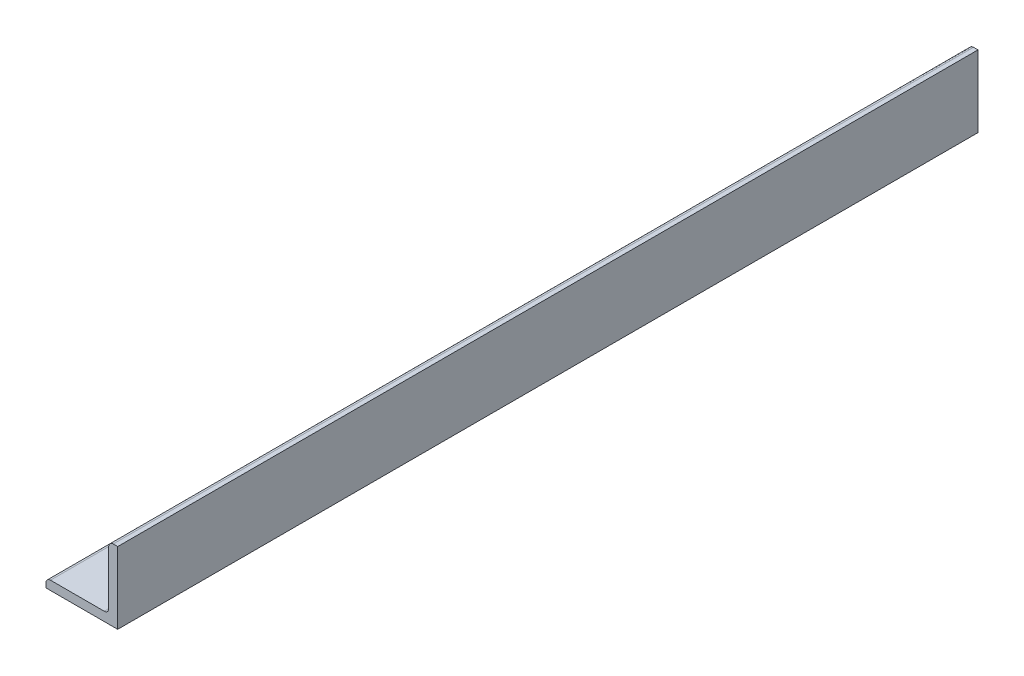
ISO-10303-21;
HEADER;
FILE_DESCRIPTION(('STEP AP214'),'2;1');
FILE_NAME('part.step','',(''),(''),'','','');
FILE_SCHEMA(('AUTOMOTIVE_DESIGN { 1 0 10303 214 1 1 1 1 }'));
ENDSEC;
DATA;
#1=APPLICATION_CONTEXT('core data for automotive mechanical design processes');
#2=APPLICATION_PROTOCOL_DEFINITION('international standard','automotive_design',2000,#1);
#3=PRODUCT_CONTEXT('',#1,'mechanical');
#4=PRODUCT('Part','Part','',(#3));
#5=PRODUCT_RELATED_PRODUCT_CATEGORY('part','',(#4));
#6=PRODUCT_DEFINITION_FORMATION('','',#4);
#7=PRODUCT_DEFINITION_CONTEXT('part definition',#1,'design');
#8=PRODUCT_DEFINITION('design','',#6,#7);
#9=PRODUCT_DEFINITION_SHAPE('','',#8);
#10=(LENGTH_UNIT() NAMED_UNIT(*) SI_UNIT(.MILLI.,.METRE.));
#11=(NAMED_UNIT(*) PLANE_ANGLE_UNIT() SI_UNIT($,.RADIAN.));
#12=(NAMED_UNIT(*) SI_UNIT($,.STERADIAN.) SOLID_ANGLE_UNIT());
#13=UNCERTAINTY_MEASURE_WITH_UNIT(LENGTH_MEASURE(1.E-05),#10,'distance_accuracy_value','');
#14=(GEOMETRIC_REPRESENTATION_CONTEXT(3) GLOBAL_UNCERTAINTY_ASSIGNED_CONTEXT((#13)) GLOBAL_UNIT_ASSIGNED_CONTEXT((#10,
#11,#12)) REPRESENTATION_CONTEXT('',''));
#15=CARTESIAN_POINT('',(0.,0.,0.));
#16=DIRECTION('',(0.,0.,1.));
#17=DIRECTION('',(1.,0.,0.));
#18=AXIS2_PLACEMENT_3D('',#15,#16,#17);
#19=CARTESIAN_POINT('',(-12.7,1.5875,152.4));
#20=DIRECTION('',(1.,0.,0.));
#21=DIRECTION('',(0.,0.,-1.));
#22=AXIS2_PLACEMENT_3D('',#19,#20,#21);
#23=PLANE('',#22);
#24=DIRECTION('',(0.,-1.,0.));
#25=VECTOR('',#24,1.);
#26=CARTESIAN_POINT('',(-12.7,1.5875,-152.4));
#27=LINE('',#26,#25);
#28=CARTESIAN_POINT('',(-12.7,1.5875,-152.4));
#29=VERTEX_POINT('',#28);
#30=CARTESIAN_POINT('',(-12.7,0.,-152.4));
#31=VERTEX_POINT('',#30);
#32=EDGE_CURVE('E134',#29,#31,#27,.T.);
#33=ORIENTED_EDGE('',*,*,#32,.T.);
#34=DIRECTION('',(0.,0.,-1.));
#35=VECTOR('',#34,1.);
#36=CARTESIAN_POINT('',(-12.7,0.,152.4));
#37=LINE('',#36,#35);
#38=CARTESIAN_POINT('',(-12.7,0.,152.4));
#39=VERTEX_POINT('',#38);
#40=EDGE_CURVE('E11',#39,#31,#37,.T.);
#41=ORIENTED_EDGE('',*,*,#40,.F.);
#42=DIRECTION('',(0.,-1.,0.));
#43=VECTOR('',#42,1.);
#44=CARTESIAN_POINT('',(-12.7,1.5875,152.4));
#45=LINE('',#44,#43);
#46=CARTESIAN_POINT('',(-12.7,1.5875,152.4));
#47=VERTEX_POINT('',#46);
#48=EDGE_CURVE('E150',#47,#39,#45,.T.);
#49=ORIENTED_EDGE('',*,*,#48,.F.);
#50=DIRECTION('',(0.,0.,-1.));
#51=VECTOR('',#50,1.);
#52=CARTESIAN_POINT('',(-12.7,1.5875,152.4));
#53=LINE('',#52,#51);
#54=EDGE_CURVE('E130',#47,#29,#53,.T.);
#55=ORIENTED_EDGE('',*,*,#54,.T.);
#56=EDGE_LOOP('',(#33,#41,#49,#55));
#57=FACE_BOUND('',#56,.T.);
#58=ADVANCED_FACE('F32',(#57),#23,.F.);
#59=CARTESIAN_POINT('',(-12.7,0.,152.4));
#60=DIRECTION('',(0.,1.,0.));
#61=DIRECTION('',(0.,0.,1.));
#62=AXIS2_PLACEMENT_3D('',#59,#60,#61);
#63=PLANE('',#62);
#64=DIRECTION('',(1.,0.,0.));
#65=VECTOR('',#64,1.);
#66=CARTESIAN_POINT('',(-12.7,0.,-152.4));
#67=LINE('',#66,#65);
#68=CARTESIAN_POINT('',(12.7,0.,-152.4));
#69=VERTEX_POINT('',#68);
#70=EDGE_CURVE('E137',#31,#69,#67,.T.);
#71=ORIENTED_EDGE('',*,*,#70,.T.);
#72=DIRECTION('',(0.,0.,-1.));
#73=VECTOR('',#72,1.);
#74=CARTESIAN_POINT('',(12.7,0.,152.4));
#75=LINE('',#74,#73);
#76=CARTESIAN_POINT('',(12.7,0.,152.4));
#77=VERTEX_POINT('',#76);
#78=EDGE_CURVE('E40',#77,#69,#75,.T.);
#79=ORIENTED_EDGE('',*,*,#78,.F.);
#80=DIRECTION('',(1.,0.,0.));
#81=VECTOR('',#80,1.);
#82=CARTESIAN_POINT('',(-12.7,0.,152.4));
#83=LINE('',#82,#81);
#84=EDGE_CURVE('E94',#39,#77,#83,.T.);
#85=ORIENTED_EDGE('',*,*,#84,.F.);
#86=ORIENTED_EDGE('',*,*,#40,.T.);
#87=EDGE_LOOP('',(#71,#79,#85,#86));
#88=FACE_BOUND('',#87,.T.);
#89=ADVANCED_FACE('F193',(#88),#63,.F.);
#90=CARTESIAN_POINT('',(12.7,0.,152.4));
#91=DIRECTION('',(-1.,0.,0.));
#92=DIRECTION('',(0.,-1.,0.));
#93=AXIS2_PLACEMENT_3D('',#90,#91,#92);
#94=PLANE('',#93);
#95=DIRECTION('',(0.,1.,0.));
#96=VECTOR('',#95,1.);
#97=CARTESIAN_POINT('',(12.7,0.,-152.4));
#98=LINE('',#97,#96);
#99=CARTESIAN_POINT('',(12.7,25.4,-152.4));
#100=VERTEX_POINT('',#99);
#101=EDGE_CURVE('E139',#69,#100,#98,.T.);
#102=ORIENTED_EDGE('',*,*,#101,.T.);
#103=DIRECTION('',(0.,0.,-1.));
#104=VECTOR('',#103,1.);
#105=CARTESIAN_POINT('',(12.7,25.4,152.4));
#106=LINE('',#105,#104);
#107=CARTESIAN_POINT('',(12.7,25.4,152.4));
#108=VERTEX_POINT('',#107);
#109=EDGE_CURVE('E160',#108,#100,#106,.T.);
#110=ORIENTED_EDGE('',*,*,#109,.F.);
#111=DIRECTION('',(0.,1.,0.));
#112=VECTOR('',#111,1.);
#113=CARTESIAN_POINT('',(12.7,0.,152.4));
#114=LINE('',#113,#112);
#115=EDGE_CURVE('E168',#77,#108,#114,.T.);
#116=ORIENTED_EDGE('',*,*,#115,.F.);
#117=ORIENTED_EDGE('',*,*,#78,.T.);
#118=EDGE_LOOP('',(#102,#110,#116,#117));
#119=FACE_BOUND('',#118,.T.);
#120=ADVANCED_FACE('F166',(#119),#94,.F.);
#121=CARTESIAN_POINT('',(11.1125,25.4,152.4));
#122=DIRECTION('',(0.,-1.,0.));
#123=DIRECTION('',(1.,0.,0.));
#124=AXIS2_PLACEMENT_3D('',#121,#122,#123);
#125=PLANE('',#124);
#126=DIRECTION('',(-1.,0.,0.));
#127=VECTOR('',#126,1.);
#128=CARTESIAN_POINT('',(11.1125,25.4,-152.4));
#129=LINE('',#128,#127);
#130=CARTESIAN_POINT('',(11.1125,25.4,-152.4));
#131=VERTEX_POINT('',#130);
#132=EDGE_CURVE('E141',#100,#131,#129,.T.);
#133=ORIENTED_EDGE('',*,*,#132,.T.);
#134=DIRECTION('',(0.,0.,-1.));
#135=VECTOR('',#134,1.);
#136=CARTESIAN_POINT('',(11.1125,25.4,152.4));
#137=LINE('',#136,#135);
#138=CARTESIAN_POINT('',(11.1125,25.4,152.4));
#139=VERTEX_POINT('',#138);
#140=EDGE_CURVE('E157',#139,#131,#137,.T.);
#141=ORIENTED_EDGE('',*,*,#140,.F.);
#142=DIRECTION('',(-1.,0.,0.));
#143=VECTOR('',#142,1.);
#144=CARTESIAN_POINT('',(11.1125,25.4,152.4));
#145=LINE('',#144,#143);
#146=EDGE_CURVE('E184',#108,#139,#145,.T.);
#147=ORIENTED_EDGE('',*,*,#146,.F.);
#148=ORIENTED_EDGE('',*,*,#109,.T.);
#149=EDGE_LOOP('',(#133,#141,#147,#148));
#150=FACE_BOUND('',#149,.T.);
#151=ADVANCED_FACE('F177',(#150),#125,.F.);
#152=CARTESIAN_POINT('',(11.1125,23.8125,152.4));
#153=DIRECTION('',(0.,0.,-1.));
#154=DIRECTION('',(-1.,0.,0.));
#155=AXIS2_PLACEMENT_3D('',#152,#153,#154);
#156=CYLINDRICAL_SURFACE('',#155,1.5875);
#157=CARTESIAN_POINT('',(11.1125,23.8125,-152.4));
#158=DIRECTION('',(0.,0.,1.));
#159=DIRECTION('',(-1.,0.,0.));
#160=AXIS2_PLACEMENT_3D('',#157,#158,#159);
#161=CIRCLE('',#160,1.5875);
#162=CARTESIAN_POINT('',(9.525,23.8125,-152.4));
#163=VERTEX_POINT('',#162);
#164=EDGE_CURVE('E143',#131,#163,#161,.T.);
#165=ORIENTED_EDGE('',*,*,#164,.T.);
#166=DIRECTION('',(0.,0.,-1.));
#167=VECTOR('',#166,1.);
#168=CARTESIAN_POINT('',(9.525,23.8125,152.4));
#169=LINE('',#168,#167);
#170=CARTESIAN_POINT('',(9.525,23.8125,152.4));
#171=VERTEX_POINT('',#170);
#172=EDGE_CURVE('E154',#171,#163,#169,.T.);
#173=ORIENTED_EDGE('',*,*,#172,.F.);
#174=CARTESIAN_POINT('',(11.1125,23.8125,152.4));
#175=DIRECTION('',(0.,0.,1.));
#176=DIRECTION('',(-1.,0.,0.));
#177=AXIS2_PLACEMENT_3D('',#174,#175,#176);
#178=CIRCLE('',#177,1.5875);
#179=EDGE_CURVE('E183',#139,#171,#178,.T.);
#180=ORIENTED_EDGE('',*,*,#179,.F.);
#181=ORIENTED_EDGE('',*,*,#140,.T.);
#182=EDGE_LOOP('',(#165,#173,#180,#181));
#183=FACE_BOUND('',#182,.T.);
#184=ADVANCED_FACE('F181',(#183),#156,.T.);
#185=CARTESIAN_POINT('',(9.525,23.8125,152.4));
#186=DIRECTION('',(1.,0.,0.));
#187=DIRECTION('',(0.,1.,0.));
#188=AXIS2_PLACEMENT_3D('',#185,#186,#187);
#189=PLANE('',#188);
#190=DIRECTION('',(0.,-1.,0.));
#191=VECTOR('',#190,1.);
#192=CARTESIAN_POINT('',(9.525,23.8125,-152.4));
#193=LINE('',#192,#191);
#194=CARTESIAN_POINT('',(9.525,4.7625,-152.4));
#195=VERTEX_POINT('',#194);
#196=EDGE_CURVE('E145',#163,#195,#193,.T.);
#197=ORIENTED_EDGE('',*,*,#196,.T.);
#198=DIRECTION('',(0.,0.,-1.));
#199=VECTOR('',#198,1.);
#200=CARTESIAN_POINT('',(9.525,4.7625,152.4));
#201=LINE('',#200,#199);
#202=CARTESIAN_POINT('',(9.525,4.7625,152.4));
#203=VERTEX_POINT('',#202);
#204=EDGE_CURVE('E125',#203,#195,#201,.T.);
#205=ORIENTED_EDGE('',*,*,#204,.F.);
#206=DIRECTION('',(0.,-1.,0.));
#207=VECTOR('',#206,1.);
#208=CARTESIAN_POINT('',(9.525,23.8125,152.4));
#209=LINE('',#208,#207);
#210=EDGE_CURVE('E116',#171,#203,#209,.T.);
#211=ORIENTED_EDGE('',*,*,#210,.F.);
#212=ORIENTED_EDGE('',*,*,#172,.T.);
#213=EDGE_LOOP('',(#197,#205,#211,#212));
#214=FACE_BOUND('',#213,.T.);
#215=ADVANCED_FACE('F205',(#214),#189,.F.);
#216=CARTESIAN_POINT('',(7.93750000000001,4.7625,152.4));
#217=DIRECTION('',(0.,0.,-1.));
#218=DIRECTION('',(-1.,0.,0.));
#219=AXIS2_PLACEMENT_3D('',#216,#217,#218);
#220=CYLINDRICAL_SURFACE('',#219,1.5875);
#221=CARTESIAN_POINT('',(7.93750000000001,4.7625,-152.4));
#222=DIRECTION('',(0.,0.,-1.));
#223=DIRECTION('',(-1.,0.,0.));
#224=AXIS2_PLACEMENT_3D('',#221,#222,#223);
#225=CIRCLE('',#224,1.5875);
#226=CARTESIAN_POINT('',(7.9375,3.175,-152.4));
#227=VERTEX_POINT('',#226);
#228=EDGE_CURVE('E124',#195,#227,#225,.T.);
#229=ORIENTED_EDGE('',*,*,#228,.T.);
#230=DIRECTION('',(0.,0.,-1.));
#231=VECTOR('',#230,1.);
#232=CARTESIAN_POINT('',(7.9375,3.175,152.4));
#233=LINE('',#232,#231);
#234=CARTESIAN_POINT('',(7.9375,3.175,152.4));
#235=VERTEX_POINT('',#234);
#236=EDGE_CURVE('E121',#235,#227,#233,.T.);
#237=ORIENTED_EDGE('',*,*,#236,.F.);
#238=CARTESIAN_POINT('',(7.93750000000001,4.7625,152.4));
#239=DIRECTION('',(0.,0.,-1.));
#240=DIRECTION('',(-1.,0.,0.));
#241=AXIS2_PLACEMENT_3D('',#238,#239,#240);
#242=CIRCLE('',#241,1.5875);
#243=EDGE_CURVE('E110',#203,#235,#242,.T.);
#244=ORIENTED_EDGE('',*,*,#243,.F.);
#245=ORIENTED_EDGE('',*,*,#204,.T.);
#246=EDGE_LOOP('',(#229,#237,#244,#245));
#247=FACE_BOUND('',#246,.T.);
#248=ADVANCED_FACE('F122',(#247),#220,.F.);
#249=CARTESIAN_POINT('',(7.9375,3.175,152.4));
#250=DIRECTION('',(0.,-1.,0.));
#251=DIRECTION('',(1.,0.,0.));
#252=AXIS2_PLACEMENT_3D('',#249,#250,#251);
#253=PLANE('',#252);
#254=DIRECTION('',(-1.,0.,0.));
#255=VECTOR('',#254,1.);
#256=CARTESIAN_POINT('',(7.9375,3.175,-152.4));
#257=LINE('',#256,#255);
#258=CARTESIAN_POINT('',(-11.1125,3.175,-152.4));
#259=VERTEX_POINT('',#258);
#260=EDGE_CURVE('E80',#227,#259,#257,.T.);
#261=ORIENTED_EDGE('',*,*,#260,.T.);
#262=DIRECTION('',(0.,0.,-1.));
#263=VECTOR('',#262,1.);
#264=CARTESIAN_POINT('',(-11.1125,3.175,152.4));
#265=LINE('',#264,#263);
#266=CARTESIAN_POINT('',(-11.1125,3.175,152.4));
#267=VERTEX_POINT('',#266);
#268=EDGE_CURVE('E126',#267,#259,#265,.T.);
#269=ORIENTED_EDGE('',*,*,#268,.F.);
#270=DIRECTION('',(-1.,0.,0.));
#271=VECTOR('',#270,1.);
#272=CARTESIAN_POINT('',(7.9375,3.175,152.4));
#273=LINE('',#272,#271);
#274=EDGE_CURVE('E114',#235,#267,#273,.T.);
#275=ORIENTED_EDGE('',*,*,#274,.F.);
#276=ORIENTED_EDGE('',*,*,#236,.T.);
#277=EDGE_LOOP('',(#261,#269,#275,#276));
#278=FACE_BOUND('',#277,.T.);
#279=ADVANCED_FACE('F128',(#278),#253,.F.);
#280=CARTESIAN_POINT('',(-11.1125,1.5875,152.4));
#281=DIRECTION('',(0.,0.,-1.));
#282=DIRECTION('',(-1.,0.,0.));
#283=AXIS2_PLACEMENT_3D('',#280,#281,#282);
#284=CYLINDRICAL_SURFACE('',#283,1.5875);
#285=CARTESIAN_POINT('',(-11.1125,1.5875,-152.4));
#286=DIRECTION('',(0.,0.,1.));
#287=DIRECTION('',(-1.,0.,0.));
#288=AXIS2_PLACEMENT_3D('',#285,#286,#287);
#289=CIRCLE('',#288,1.5875);
#290=EDGE_CURVE('E86',#259,#29,#289,.T.);
#291=ORIENTED_EDGE('',*,*,#290,.T.);
#292=ORIENTED_EDGE('',*,*,#54,.F.);
#293=CARTESIAN_POINT('',(-11.1125,1.5875,152.4));
#294=DIRECTION('',(0.,0.,1.));
#295=DIRECTION('',(-1.,0.,0.));
#296=AXIS2_PLACEMENT_3D('',#293,#294,#295);
#297=CIRCLE('',#296,1.5875);
#298=EDGE_CURVE('E48',#267,#47,#297,.T.);
#299=ORIENTED_EDGE('',*,*,#298,.F.);
#300=ORIENTED_EDGE('',*,*,#268,.T.);
#301=EDGE_LOOP('',(#291,#292,#299,#300));
#302=FACE_BOUND('',#301,.T.);
#303=ADVANCED_FACE('F213',(#302),#284,.T.);
#304=CARTESIAN_POINT('',(11.1125,23.8125,152.4));
#305=DIRECTION('',(0.,0.,-1.));
#306=DIRECTION('',(-1.,0.,0.));
#307=AXIS2_PLACEMENT_3D('',#304,#305,#306);
#308=PLANE('',#307);
#309=ORIENTED_EDGE('',*,*,#48,.T.);
#310=ORIENTED_EDGE('',*,*,#84,.T.);
#311=ORIENTED_EDGE('',*,*,#115,.T.);
#312=ORIENTED_EDGE('',*,*,#146,.T.);
#313=ORIENTED_EDGE('',*,*,#179,.T.);
#314=ORIENTED_EDGE('',*,*,#210,.T.);
#315=ORIENTED_EDGE('',*,*,#243,.T.);
#316=ORIENTED_EDGE('',*,*,#274,.T.);
#317=ORIENTED_EDGE('',*,*,#298,.T.);
#318=EDGE_LOOP('',(#309,#310,#311,#312,#313,#314,#315,#316,#317));
#319=FACE_BOUND('',#318,.T.);
#320=ADVANCED_FACE('F112',(#319),#308,.F.);
#321=CARTESIAN_POINT('',(11.1125,23.8125,-152.4));
#322=DIRECTION('',(0.,0.,-1.));
#323=DIRECTION('',(-1.,0.,0.));
#324=AXIS2_PLACEMENT_3D('',#321,#322,#323);
#325=PLANE('',#324);
#326=ORIENTED_EDGE('',*,*,#32,.F.);
#327=ORIENTED_EDGE('',*,*,#290,.F.);
#328=ORIENTED_EDGE('',*,*,#260,.F.);
#329=ORIENTED_EDGE('',*,*,#228,.F.);
#330=ORIENTED_EDGE('',*,*,#196,.F.);
#331=ORIENTED_EDGE('',*,*,#164,.F.);
#332=ORIENTED_EDGE('',*,*,#132,.F.);
#333=ORIENTED_EDGE('',*,*,#101,.F.);
#334=ORIENTED_EDGE('',*,*,#70,.F.);
#335=EDGE_LOOP('',(#326,#327,#328,#329,#330,#331,#332,#333,#334));
#336=FACE_BOUND('',#335,.T.);
#337=ADVANCED_FACE('F172',(#336),#325,.T.);
#338=CLOSED_SHELL('',(#58,#89,#120,#151,#184,#215,#248,#279,#303,#320,#337));
#339=MANIFOLD_SOLID_BREP('B2',#338);
#340=ADVANCED_BREP_SHAPE_REPRESENTATION('',(#18,#339),#14);
#341=SHAPE_DEFINITION_REPRESENTATION(#9,#340);
ENDSEC;
END-ISO-10303-21;
